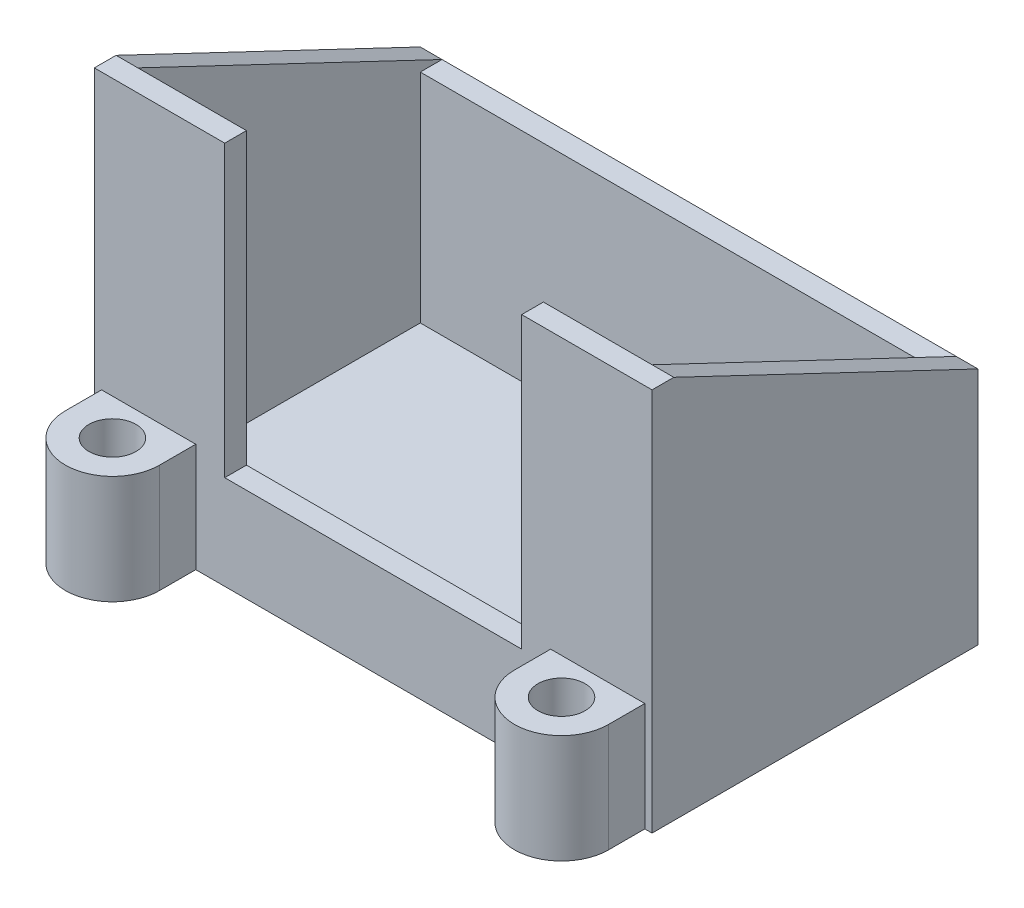
ISO-10303-21;
HEADER;
FILE_DESCRIPTION(('STEP AP214'),'2;1');
FILE_NAME('part.step','',(''),(''),'','','');
FILE_SCHEMA(('AUTOMOTIVE_DESIGN { 1 0 10303 214 1 1 1 1 }'));
ENDSEC;
DATA;
#1=APPLICATION_CONTEXT('core data for automotive mechanical design processes');
#2=APPLICATION_PROTOCOL_DEFINITION('international standard','automotive_design',2000,#1);
#3=PRODUCT_CONTEXT('',#1,'mechanical');
#4=PRODUCT('Part','Part','',(#3));
#5=PRODUCT_RELATED_PRODUCT_CATEGORY('part','',(#4));
#6=PRODUCT_DEFINITION_FORMATION('','',#4);
#7=PRODUCT_DEFINITION_CONTEXT('part definition',#1,'design');
#8=PRODUCT_DEFINITION('design','',#6,#7);
#9=PRODUCT_DEFINITION_SHAPE('','',#8);
#10=(LENGTH_UNIT() NAMED_UNIT(*) SI_UNIT(.MILLI.,.METRE.));
#11=(NAMED_UNIT(*) PLANE_ANGLE_UNIT() SI_UNIT($,.RADIAN.));
#12=(NAMED_UNIT(*) SI_UNIT($,.STERADIAN.) SOLID_ANGLE_UNIT());
#13=UNCERTAINTY_MEASURE_WITH_UNIT(LENGTH_MEASURE(1.E-05),#10,'distance_accuracy_value','');
#14=(GEOMETRIC_REPRESENTATION_CONTEXT(3) GLOBAL_UNCERTAINTY_ASSIGNED_CONTEXT((#13)) GLOBAL_UNIT_ASSIGNED_CONTEXT((#10,
#11,#12)) REPRESENTATION_CONTEXT('',''));
#15=CARTESIAN_POINT('',(0.,0.,0.));
#16=DIRECTION('',(0.,0.,1.));
#17=DIRECTION('',(1.,0.,0.));
#18=AXIS2_PLACEMENT_3D('',#15,#16,#17);
#19=CARTESIAN_POINT('',(38.5,33.,22.5));
#20=DIRECTION('',(0.,0.,-1.));
#21=DIRECTION('',(-1.,0.,0.));
#22=AXIS2_PLACEMENT_3D('',#19,#20,#21);
#23=PLANE('',#22);
#24=DIRECTION('',(0.,-1.,0.));
#25=VECTOR('',#24,1.);
#26=CARTESIAN_POINT('',(37.5,15.,22.5));
#27=LINE('',#26,#25);
#28=CARTESIAN_POINT('',(37.5,15.,22.5));
#29=VERTEX_POINT('',#28);
#30=CARTESIAN_POINT('',(37.5,0.,22.5));
#31=VERTEX_POINT('',#30);
#32=EDGE_CURVE('E195',#29,#31,#27,.T.);
#33=ORIENTED_EDGE('',*,*,#32,.T.);
#34=DIRECTION('',(1.,0.,0.));
#35=VECTOR('',#34,1.);
#36=CARTESIAN_POINT('',(38.5,0.,22.5));
#37=LINE('',#36,#35);
#38=CARTESIAN_POINT('',(38.5,0.,22.5));
#39=VERTEX_POINT('',#38);
#40=EDGE_CURVE('E396',#31,#39,#37,.T.);
#41=ORIENTED_EDGE('',*,*,#40,.T.);
#42=DIRECTION('',(0.,-1.,0.));
#43=VECTOR('',#42,1.);
#44=CARTESIAN_POINT('',(38.5,33.,22.5));
#45=LINE('',#44,#43);
#46=CARTESIAN_POINT('',(38.5,53.,22.5));
#47=VERTEX_POINT('',#46);
#48=EDGE_CURVE('E48',#47,#39,#45,.T.);
#49=ORIENTED_EDGE('',*,*,#48,.F.);
#50=DIRECTION('',(1.,0.,0.));
#51=VECTOR('',#50,1.);
#52=CARTESIAN_POINT('',(20.5,53.,22.5));
#53=LINE('',#52,#51);
#54=CARTESIAN_POINT('',(20.5,53.,22.5));
#55=VERTEX_POINT('',#54);
#56=EDGE_CURVE('E312',#55,#47,#53,.T.);
#57=ORIENTED_EDGE('',*,*,#56,.F.);
#58=DIRECTION('',(0.,1.,0.));
#59=VECTOR('',#58,1.);
#60=CARTESIAN_POINT('',(20.5,3.,22.5));
#61=LINE('',#60,#59);
#62=CARTESIAN_POINT('',(20.5,13.,22.5));
#63=VERTEX_POINT('',#62);
#64=EDGE_CURVE('E377',#63,#55,#61,.T.);
#65=ORIENTED_EDGE('',*,*,#64,.F.);
#66=DIRECTION('',(1.,0.,0.));
#67=VECTOR('',#66,1.);
#68=CARTESIAN_POINT('',(-20.5,13.,22.5));
#69=LINE('',#68,#67);
#70=CARTESIAN_POINT('',(-20.5,13.,22.5));
#71=VERTEX_POINT('',#70);
#72=EDGE_CURVE('E270',#71,#63,#69,.T.);
#73=ORIENTED_EDGE('',*,*,#72,.F.);
#74=DIRECTION('',(0.,1.,0.));
#75=VECTOR('',#74,1.);
#76=CARTESIAN_POINT('',(-20.5,3.,22.5));
#77=LINE('',#76,#75);
#78=CARTESIAN_POINT('',(-20.5,53.,22.5));
#79=VERTEX_POINT('',#78);
#80=EDGE_CURVE('E380',#71,#79,#77,.T.);
#81=ORIENTED_EDGE('',*,*,#80,.T.);
#82=DIRECTION('',(1.,0.,0.));
#83=VECTOR('',#82,1.);
#84=CARTESIAN_POINT('',(-20.5,53.,22.5));
#85=LINE('',#84,#83);
#86=CARTESIAN_POINT('',(-38.5,53.,22.5));
#87=VERTEX_POINT('',#86);
#88=EDGE_CURVE('E337',#87,#79,#85,.T.);
#89=ORIENTED_EDGE('',*,*,#88,.F.);
#90=DIRECTION('',(0.,-1.,0.));
#91=VECTOR('',#90,1.);
#92=CARTESIAN_POINT('',(-38.5,33.,22.5));
#93=LINE('',#92,#91);
#94=CARTESIAN_POINT('',(-38.5,0.,22.5));
#95=VERTEX_POINT('',#94);
#96=EDGE_CURVE('E11',#87,#95,#93,.T.);
#97=ORIENTED_EDGE('',*,*,#96,.T.);
#98=CARTESIAN_POINT('',(-37.5,0.,22.5));
#99=VERTEX_POINT('',#98);
#100=EDGE_CURVE('E397',#95,#99,#37,.T.);
#101=ORIENTED_EDGE('',*,*,#100,.T.);
#102=DIRECTION('',(0.,-1.,0.));
#103=VECTOR('',#102,1.);
#104=CARTESIAN_POINT('',(-37.5,15.,22.5));
#105=LINE('',#104,#103);
#106=CARTESIAN_POINT('',(-37.5,15.,22.5));
#107=VERTEX_POINT('',#106);
#108=EDGE_CURVE('E255',#107,#99,#105,.T.);
#109=ORIENTED_EDGE('',*,*,#108,.F.);
#110=DIRECTION('',(-1.,0.,0.));
#111=VECTOR('',#110,1.);
#112=CARTESIAN_POINT('',(-24.5,15.,22.5));
#113=LINE('',#112,#111);
#114=CARTESIAN_POINT('',(-24.5,15.,22.5));
#115=VERTEX_POINT('',#114);
#116=EDGE_CURVE('E237',#115,#107,#113,.T.);
#117=ORIENTED_EDGE('',*,*,#116,.F.);
#118=DIRECTION('',(0.,-1.,0.));
#119=VECTOR('',#118,1.);
#120=CARTESIAN_POINT('',(-24.5,15.,22.5));
#121=LINE('',#120,#119);
#122=CARTESIAN_POINT('',(-24.5,0.,22.5));
#123=VERTEX_POINT('',#122);
#124=EDGE_CURVE('E258',#115,#123,#121,.T.);
#125=ORIENTED_EDGE('',*,*,#124,.T.);
#126=CARTESIAN_POINT('',(24.5,0.,22.5));
#127=VERTEX_POINT('',#126);
#128=EDGE_CURVE('E402',#123,#127,#37,.T.);
#129=ORIENTED_EDGE('',*,*,#128,.T.);
#130=DIRECTION('',(0.,-1.,0.));
#131=VECTOR('',#130,1.);
#132=CARTESIAN_POINT('',(24.5,15.,22.5));
#133=LINE('',#132,#131);
#134=CARTESIAN_POINT('',(24.5,15.,22.5));
#135=VERTEX_POINT('',#134);
#136=EDGE_CURVE('E60',#135,#127,#133,.T.);
#137=ORIENTED_EDGE('',*,*,#136,.F.);
#138=DIRECTION('',(-1.,0.,0.));
#139=VECTOR('',#138,1.);
#140=CARTESIAN_POINT('',(37.5,15.,22.5));
#141=LINE('',#140,#139);
#142=EDGE_CURVE('E55',#29,#135,#141,.T.);
#143=ORIENTED_EDGE('',*,*,#142,.F.);
#144=EDGE_LOOP('',(#33,#41,#49,#57,#65,#73,#81,#89,#97,#101,#109,#117,#125,#129,#137,#143));
#145=FACE_BOUND('',#144,.T.);
#146=ADVANCED_FACE('F39',(#145),#23,.F.);
#147=CARTESIAN_POINT('',(0.,3.,0.));
#148=DIRECTION('',(0.,1.,0.));
#149=DIRECTION('',(0.,0.,1.));
#150=AXIS2_PLACEMENT_3D('',#147,#148,#149);
#151=PLANE('',#150);
#152=DIRECTION('',(0.,0.,1.));
#153=VECTOR('',#152,1.);
#154=CARTESIAN_POINT('',(-35.5,3.,19.5));
#155=LINE('',#154,#153);
#156=CARTESIAN_POINT('',(-35.5,3.,-19.5));
#157=VERTEX_POINT('',#156);
#158=CARTESIAN_POINT('',(-35.5,3.,19.5));
#159=VERTEX_POINT('',#158);
#160=EDGE_CURVE('E342',#157,#159,#155,.T.);
#161=ORIENTED_EDGE('',*,*,#160,.T.);
#162=DIRECTION('',(1.,0.,0.));
#163=VECTOR('',#162,1.);
#164=CARTESIAN_POINT('',(20.5,3.,19.5));
#165=LINE('',#164,#163);
#166=CARTESIAN_POINT('',(35.5,3.,19.5));
#167=VERTEX_POINT('',#166);
#168=EDGE_CURVE('E346',#159,#167,#165,.T.);
#169=ORIENTED_EDGE('',*,*,#168,.T.);
#170=DIRECTION('',(0.,0.,-1.));
#171=VECTOR('',#170,1.);
#172=CARTESIAN_POINT('',(35.5,3.,19.5));
#173=LINE('',#172,#171);
#174=CARTESIAN_POINT('',(35.5,3.,-19.5));
#175=VERTEX_POINT('',#174);
#176=EDGE_CURVE('E350',#167,#175,#173,.T.);
#177=ORIENTED_EDGE('',*,*,#176,.T.);
#178=DIRECTION('',(-1.,0.,0.));
#179=VECTOR('',#178,1.);
#180=CARTESIAN_POINT('',(35.5,3.,-19.5));
#181=LINE('',#180,#179);
#182=EDGE_CURVE('E354',#175,#157,#181,.T.);
#183=ORIENTED_EDGE('',*,*,#182,.T.);
#184=EDGE_LOOP('',(#161,#169,#177,#183));
#185=FACE_BOUND('',#184,.T.);
#186=ADVANCED_FACE('F472',(#185),#151,.T.);
#187=CARTESIAN_POINT('',(0.,33.,0.));
#188=DIRECTION('',(0.,1.,0.));
#189=DIRECTION('',(0.,0.,1.));
#190=AXIS2_PLACEMENT_3D('',#187,#188,#189);
#191=PLANE('',#190);
#192=DIRECTION('',(-1.,0.,0.));
#193=VECTOR('',#192,1.);
#194=CARTESIAN_POINT('',(38.5,33.,-22.5));
#195=LINE('',#194,#193);
#196=CARTESIAN_POINT('',(35.5,33.,-22.5));
#197=VERTEX_POINT('',#196);
#198=CARTESIAN_POINT('',(-35.5,33.,-22.5));
#199=VERTEX_POINT('',#198);
#200=EDGE_CURVE('E392',#197,#199,#195,.T.);
#201=ORIENTED_EDGE('',*,*,#200,.T.);
#202=DIRECTION('',(0.,0.,-1.));
#203=VECTOR('',#202,1.);
#204=CARTESIAN_POINT('',(-35.5,33.,-22.5));
#205=LINE('',#204,#203);
#206=CARTESIAN_POINT('',(-35.5,33.,-19.5));
#207=VERTEX_POINT('',#206);
#208=EDGE_CURVE('E284',#207,#199,#205,.T.);
#209=ORIENTED_EDGE('',*,*,#208,.F.);
#210=DIRECTION('',(-1.,0.,0.));
#211=VECTOR('',#210,1.);
#212=CARTESIAN_POINT('',(35.5,33.,-19.5));
#213=LINE('',#212,#211);
#214=CARTESIAN_POINT('',(35.5,33.,-19.5));
#215=VERTEX_POINT('',#214);
#216=EDGE_CURVE('E341',#215,#207,#213,.T.);
#217=ORIENTED_EDGE('',*,*,#216,.F.);
#218=DIRECTION('',(0.,0.,-1.));
#219=VECTOR('',#218,1.);
#220=CARTESIAN_POINT('',(35.5,33.,-22.5));
#221=LINE('',#220,#219);
#222=EDGE_CURVE('E301',#215,#197,#221,.T.);
#223=ORIENTED_EDGE('',*,*,#222,.T.);
#224=EDGE_LOOP('',(#201,#209,#217,#223));
#225=FACE_BOUND('',#224,.T.);
#226=ADVANCED_FACE('F456',(#225),#191,.T.);
#227=CARTESIAN_POINT('',(20.5,3.,19.5));
#228=DIRECTION('',(0.,0.,1.));
#229=DIRECTION('',(1.,0.,0.));
#230=AXIS2_PLACEMENT_3D('',#227,#228,#229);
#231=PLANE('',#230);
#232=DIRECTION('',(-1.,0.,0.));
#233=VECTOR('',#232,1.);
#234=CARTESIAN_POINT('',(20.5,53.,19.5));
#235=LINE('',#234,#233);
#236=CARTESIAN_POINT('',(35.5,53.,19.5));
#237=VERTEX_POINT('',#236);
#238=CARTESIAN_POINT('',(20.5,53.,19.5));
#239=VERTEX_POINT('',#238);
#240=EDGE_CURVE('E320',#237,#239,#235,.T.);
#241=ORIENTED_EDGE('',*,*,#240,.F.);
#242=DIRECTION('',(0.,1.,0.));
#243=VECTOR('',#242,1.);
#244=CARTESIAN_POINT('',(35.5,3.,19.5));
#245=LINE('',#244,#243);
#246=EDGE_CURVE('E371',#167,#237,#245,.T.);
#247=ORIENTED_EDGE('',*,*,#246,.F.);
#248=ORIENTED_EDGE('',*,*,#168,.F.);
#249=DIRECTION('',(0.,1.,0.));
#250=VECTOR('',#249,1.);
#251=CARTESIAN_POINT('',(-35.5,3.,19.5));
#252=LINE('',#251,#250);
#253=CARTESIAN_POINT('',(-35.5,53.,19.5));
#254=VERTEX_POINT('',#253);
#255=EDGE_CURVE('E358',#159,#254,#252,.T.);
#256=ORIENTED_EDGE('',*,*,#255,.T.);
#257=DIRECTION('',(-1.,0.,0.));
#258=VECTOR('',#257,1.);
#259=CARTESIAN_POINT('',(-20.5,53.,19.5));
#260=LINE('',#259,#258);
#261=CARTESIAN_POINT('',(-20.5,53.,19.5));
#262=VERTEX_POINT('',#261);
#263=EDGE_CURVE('E329',#262,#254,#260,.T.);
#264=ORIENTED_EDGE('',*,*,#263,.F.);
#265=DIRECTION('',(0.,1.,0.));
#266=VECTOR('',#265,1.);
#267=CARTESIAN_POINT('',(-20.5,3.,19.5));
#268=LINE('',#267,#266);
#269=CARTESIAN_POINT('',(-20.5,13.,19.5));
#270=VERTEX_POINT('',#269);
#271=EDGE_CURVE('E383',#270,#262,#268,.T.);
#272=ORIENTED_EDGE('',*,*,#271,.F.);
#273=DIRECTION('',(-1.,0.,0.));
#274=VECTOR('',#273,1.);
#275=CARTESIAN_POINT('',(-20.5,13.,19.5));
#276=LINE('',#275,#274);
#277=CARTESIAN_POINT('',(20.5,13.,19.5));
#278=VERTEX_POINT('',#277);
#279=EDGE_CURVE('E276',#278,#270,#276,.T.);
#280=ORIENTED_EDGE('',*,*,#279,.F.);
#281=DIRECTION('',(0.,1.,0.));
#282=VECTOR('',#281,1.);
#283=CARTESIAN_POINT('',(20.5,3.,19.5));
#284=LINE('',#283,#282);
#285=EDGE_CURVE('E374',#278,#239,#284,.T.);
#286=ORIENTED_EDGE('',*,*,#285,.T.);
#287=EDGE_LOOP('',(#241,#247,#248,#256,#264,#272,#280,#286));
#288=FACE_BOUND('',#287,.T.);
#289=ADVANCED_FACE('F447',(#288),#231,.F.);
#290=CARTESIAN_POINT('',(-38.5,33.,22.5));
#291=DIRECTION('',(1.,0.,0.));
#292=DIRECTION('',(0.,0.,-1.));
#293=AXIS2_PLACEMENT_3D('',#290,#291,#292);
#294=PLANE('',#293);
#295=DIRECTION('',(0.,0.,1.));
#296=VECTOR('',#295,1.);
#297=CARTESIAN_POINT('',(-38.5,0.,22.5));
#298=LINE('',#297,#296);
#299=CARTESIAN_POINT('',(-38.5,0.,-22.5));
#300=VERTEX_POINT('',#299);
#301=EDGE_CURVE('E366',#300,#95,#298,.T.);
#302=ORIENTED_EDGE('',*,*,#301,.T.);
#303=ORIENTED_EDGE('',*,*,#96,.F.);
#304=DIRECTION('',(0.,0.,1.));
#305=VECTOR('',#304,1.);
#306=CARTESIAN_POINT('',(-38.5,53.,19.5));
#307=LINE('',#306,#305);
#308=CARTESIAN_POINT('',(-38.5,53.,19.5));
#309=VERTEX_POINT('',#308);
#310=EDGE_CURVE('E333',#309,#87,#307,.T.);
#311=ORIENTED_EDGE('',*,*,#310,.F.);
#312=DIRECTION('',(0.,0.429933580392348,0.90286051882393));
#313=VECTOR('',#312,1.);
#314=CARTESIAN_POINT('',(-38.5,53.,19.5));
#315=LINE('',#314,#313);
#316=CARTESIAN_POINT('',(-38.5,33.,-22.5));
#317=VERTEX_POINT('',#316);
#318=EDGE_CURVE('E279',#317,#309,#315,.T.);
#319=ORIENTED_EDGE('',*,*,#318,.F.);
#320=DIRECTION('',(0.,-1.,0.));
#321=VECTOR('',#320,1.);
#322=CARTESIAN_POINT('',(-38.5,33.,-22.5));
#323=LINE('',#322,#321);
#324=EDGE_CURVE('E391',#317,#300,#323,.T.);
#325=ORIENTED_EDGE('',*,*,#324,.T.);
#326=EDGE_LOOP('',(#302,#303,#311,#319,#325));
#327=FACE_BOUND('',#326,.T.);
#328=ADVANCED_FACE('F41',(#327),#294,.F.);
#329=CARTESIAN_POINT('',(38.5,33.,22.5));
#330=DIRECTION('',(-1.,0.,0.));
#331=DIRECTION('',(0.,0.,1.));
#332=AXIS2_PLACEMENT_3D('',#329,#330,#331);
#333=PLANE('',#332);
#334=DIRECTION('',(0.,-1.,0.));
#335=VECTOR('',#334,1.);
#336=CARTESIAN_POINT('',(38.5,33.,-22.5));
#337=LINE('',#336,#335);
#338=CARTESIAN_POINT('',(38.5,33.,-22.5));
#339=VERTEX_POINT('',#338);
#340=CARTESIAN_POINT('',(38.5,0.,-22.5));
#341=VERTEX_POINT('',#340);
#342=EDGE_CURVE('E411',#339,#341,#337,.T.);
#343=ORIENTED_EDGE('',*,*,#342,.F.);
#344=DIRECTION('',(0.,0.429933580392348,0.90286051882393));
#345=VECTOR('',#344,1.);
#346=CARTESIAN_POINT('',(38.5,53.,19.5));
#347=LINE('',#346,#345);
#348=CARTESIAN_POINT('',(38.5,53.,19.5));
#349=VERTEX_POINT('',#348);
#350=EDGE_CURVE('E294',#339,#349,#347,.T.);
#351=ORIENTED_EDGE('',*,*,#350,.T.);
#352=DIRECTION('',(0.,0.,-1.));
#353=VECTOR('',#352,1.);
#354=CARTESIAN_POINT('',(38.5,53.,19.5));
#355=LINE('',#354,#353);
#356=EDGE_CURVE('E316',#47,#349,#355,.T.);
#357=ORIENTED_EDGE('',*,*,#356,.F.);
#358=ORIENTED_EDGE('',*,*,#48,.T.);
#359=DIRECTION('',(0.,0.,-1.));
#360=VECTOR('',#359,1.);
#361=CARTESIAN_POINT('',(38.5,0.,22.5));
#362=LINE('',#361,#360);
#363=EDGE_CURVE('E401',#39,#341,#362,.T.);
#364=ORIENTED_EDGE('',*,*,#363,.T.);
#365=EDGE_LOOP('',(#343,#351,#357,#358,#364));
#366=FACE_BOUND('',#365,.T.);
#367=ADVANCED_FACE('F420',(#366),#333,.F.);
#368=CARTESIAN_POINT('',(38.5,33.,-22.5));
#369=DIRECTION('',(0.,0.,1.));
#370=DIRECTION('',(1.,0.,0.));
#371=AXIS2_PLACEMENT_3D('',#368,#369,#370);
#372=PLANE('',#371);
#373=DIRECTION('',(-1.,0.,0.));
#374=VECTOR('',#373,1.);
#375=CARTESIAN_POINT('',(38.5,0.,-22.5));
#376=LINE('',#375,#374);
#377=EDGE_CURVE('E405',#341,#300,#376,.T.);
#378=ORIENTED_EDGE('',*,*,#377,.T.);
#379=ORIENTED_EDGE('',*,*,#324,.F.);
#380=DIRECTION('',(-1.,0.,0.));
#381=VECTOR('',#380,1.);
#382=CARTESIAN_POINT('',(-35.5,33.,-22.5));
#383=LINE('',#382,#381);
#384=EDGE_CURVE('E287',#199,#317,#383,.T.);
#385=ORIENTED_EDGE('',*,*,#384,.F.);
#386=ORIENTED_EDGE('',*,*,#200,.F.);
#387=EDGE_CURVE('E388',#339,#197,#195,.T.);
#388=ORIENTED_EDGE('',*,*,#387,.F.);
#389=ORIENTED_EDGE('',*,*,#342,.T.);
#390=EDGE_LOOP('',(#378,#379,#385,#386,#388,#389));
#391=FACE_BOUND('',#390,.T.);
#392=ADVANCED_FACE('F429',(#391),#372,.F.);
#393=CARTESIAN_POINT('',(0.,0.,0.));
#394=DIRECTION('',(0.,1.,0.));
#395=DIRECTION('',(0.,0.,1.));
#396=AXIS2_PLACEMENT_3D('',#393,#394,#395);
#397=PLANE('',#396);
#398=ORIENTED_EDGE('',*,*,#301,.F.);
#399=ORIENTED_EDGE('',*,*,#377,.F.);
#400=ORIENTED_EDGE('',*,*,#363,.F.);
#401=ORIENTED_EDGE('',*,*,#40,.F.);
#402=DIRECTION('',(0.,0.,-1.));
#403=VECTOR('',#402,1.);
#404=CARTESIAN_POINT('',(37.5,0.,27.5));
#405=LINE('',#404,#403);
#406=CARTESIAN_POINT('',(37.5,0.,27.5));
#407=VERTEX_POINT('',#406);
#408=EDGE_CURVE('E574',#407,#31,#405,.T.);
#409=ORIENTED_EDGE('',*,*,#408,.F.);
#410=CARTESIAN_POINT('',(31.,0.,27.5));
#411=DIRECTION('',(0.,1.,0.));
#412=DIRECTION('',(0.,0.,1.));
#413=AXIS2_PLACEMENT_3D('',#410,#411,#412);
#414=CIRCLE('',#413,6.5);
#415=CARTESIAN_POINT('',(24.5,0.,27.5));
#416=VERTEX_POINT('',#415);
#417=EDGE_CURVE('E213',#416,#407,#414,.T.);
#418=ORIENTED_EDGE('',*,*,#417,.F.);
#419=DIRECTION('',(0.,0.,1.));
#420=VECTOR('',#419,1.);
#421=CARTESIAN_POINT('',(24.5,0.,22.5));
#422=LINE('',#421,#420);
#423=EDGE_CURVE('E209',#127,#416,#422,.T.);
#424=ORIENTED_EDGE('',*,*,#423,.F.);
#425=ORIENTED_EDGE('',*,*,#128,.F.);
#426=DIRECTION('',(0.,0.,-1.));
#427=VECTOR('',#426,1.);
#428=CARTESIAN_POINT('',(-24.5,0.,27.5));
#429=LINE('',#428,#427);
#430=CARTESIAN_POINT('',(-24.5,0.,27.5));
#431=VERTEX_POINT('',#430);
#432=EDGE_CURVE('E247',#431,#123,#429,.T.);
#433=ORIENTED_EDGE('',*,*,#432,.F.);
#434=CARTESIAN_POINT('',(-31.,0.,27.5));
#435=DIRECTION('',(0.,1.,0.));
#436=DIRECTION('',(0.,0.,-1.));
#437=AXIS2_PLACEMENT_3D('',#434,#435,#436);
#438=CIRCLE('',#437,6.5);
#439=CARTESIAN_POINT('',(-37.5,0.,27.5));
#440=VERTEX_POINT('',#439);
#441=EDGE_CURVE('E227',#440,#431,#438,.T.);
#442=ORIENTED_EDGE('',*,*,#441,.F.);
#443=DIRECTION('',(0.,0.,1.));
#444=VECTOR('',#443,1.);
#445=CARTESIAN_POINT('',(-37.5,0.,27.5));
#446=LINE('',#445,#444);
#447=EDGE_CURVE('E234',#99,#440,#446,.T.);
#448=ORIENTED_EDGE('',*,*,#447,.F.);
#449=ORIENTED_EDGE('',*,*,#100,.F.);
#450=EDGE_LOOP('',(#398,#399,#400,#401,#409,#418,#424,#425,#433,#442,#448,#449));
#451=FACE_BOUND('',#450,.T.);
#452=CARTESIAN_POINT('',(-31.,0.,27.5));
#453=DIRECTION('',(0.,1.,0.));
#454=DIRECTION('',(0.,0.,1.));
#455=AXIS2_PLACEMENT_3D('',#452,#453,#454);
#456=CIRCLE('',#455,3.25);
#457=CARTESIAN_POINT('',(-31.,0.,30.75));
#458=VERTEX_POINT('',#457);
#459=EDGE_CURVE('E215',#458,#458,#456,.T.);
#460=ORIENTED_EDGE('',*,*,#459,.T.);
#461=EDGE_LOOP('',(#460));
#462=FACE_BOUND('',#461,.T.);
#463=CARTESIAN_POINT('',(31.,0.,27.5));
#464=DIRECTION('',(0.,1.,0.));
#465=DIRECTION('',(0.,0.,1.));
#466=AXIS2_PLACEMENT_3D('',#463,#464,#465);
#467=CIRCLE('',#466,3.24999999999999);
#468=CARTESIAN_POINT('',(31.,0.,30.75));
#469=VERTEX_POINT('',#468);
#470=EDGE_CURVE('E560',#469,#469,#467,.T.);
#471=ORIENTED_EDGE('',*,*,#470,.T.);
#472=EDGE_LOOP('',(#471));
#473=FACE_BOUND('',#472,.T.);
#474=ADVANCED_FACE('F425',(#451,#462,#473),#397,.F.);
#475=CARTESIAN_POINT('',(-35.5,3.,19.5));
#476=DIRECTION('',(-1.,0.,0.));
#477=DIRECTION('',(0.,0.,1.));
#478=AXIS2_PLACEMENT_3D('',#475,#476,#477);
#479=PLANE('',#478);
#480=DIRECTION('',(0.,1.,0.));
#481=VECTOR('',#480,1.);
#482=CARTESIAN_POINT('',(-35.5,3.,-19.5));
#483=LINE('',#482,#481);
#484=EDGE_CURVE('E362',#157,#207,#483,.T.);
#485=ORIENTED_EDGE('',*,*,#484,.T.);
#486=ORIENTED_EDGE('',*,*,#208,.T.);
#487=DIRECTION('',(0.,0.429933580392348,0.90286051882393));
#488=VECTOR('',#487,1.);
#489=CARTESIAN_POINT('',(-35.5,53.,19.5));
#490=LINE('',#489,#488);
#491=EDGE_CURVE('E280',#199,#254,#490,.T.);
#492=ORIENTED_EDGE('',*,*,#491,.T.);
#493=ORIENTED_EDGE('',*,*,#255,.F.);
#494=ORIENTED_EDGE('',*,*,#160,.F.);
#495=EDGE_LOOP('',(#485,#486,#492,#493,#494));
#496=FACE_BOUND('',#495,.T.);
#497=ADVANCED_FACE('F452',(#496),#479,.F.);
#498=CARTESIAN_POINT('',(35.5,3.,-19.5));
#499=DIRECTION('',(0.,0.,-1.));
#500=DIRECTION('',(-1.,0.,0.));
#501=AXIS2_PLACEMENT_3D('',#498,#499,#500);
#502=PLANE('',#501);
#503=ORIENTED_EDGE('',*,*,#216,.T.);
#504=ORIENTED_EDGE('',*,*,#484,.F.);
#505=ORIENTED_EDGE('',*,*,#182,.F.);
#506=DIRECTION('',(0.,1.,0.));
#507=VECTOR('',#506,1.);
#508=CARTESIAN_POINT('',(35.5,3.,-19.5));
#509=LINE('',#508,#507);
#510=EDGE_CURVE('E367',#175,#215,#509,.T.);
#511=ORIENTED_EDGE('',*,*,#510,.T.);
#512=EDGE_LOOP('',(#503,#504,#505,#511));
#513=FACE_BOUND('',#512,.T.);
#514=ADVANCED_FACE('F489',(#513),#502,.F.);
#515=CARTESIAN_POINT('',(35.5,3.,19.5));
#516=DIRECTION('',(1.,0.,0.));
#517=DIRECTION('',(0.,0.,-1.));
#518=AXIS2_PLACEMENT_3D('',#515,#516,#517);
#519=PLANE('',#518);
#520=ORIENTED_EDGE('',*,*,#246,.T.);
#521=DIRECTION('',(0.,0.429933580392348,0.90286051882393));
#522=VECTOR('',#521,1.);
#523=CARTESIAN_POINT('',(35.5,53.,19.5));
#524=LINE('',#523,#522);
#525=EDGE_CURVE('E297',#197,#237,#524,.T.);
#526=ORIENTED_EDGE('',*,*,#525,.F.);
#527=ORIENTED_EDGE('',*,*,#222,.F.);
#528=ORIENTED_EDGE('',*,*,#510,.F.);
#529=ORIENTED_EDGE('',*,*,#176,.F.);
#530=EDGE_LOOP('',(#520,#526,#527,#528,#529));
#531=FACE_BOUND('',#530,.T.);
#532=ADVANCED_FACE('F496',(#531),#519,.F.);
#533=CARTESIAN_POINT('',(20.5,3.,19.5));
#534=DIRECTION('',(1.,0.,0.));
#535=DIRECTION('',(0.,0.,-1.));
#536=AXIS2_PLACEMENT_3D('',#533,#534,#535);
#537=PLANE('',#536);
#538=ORIENTED_EDGE('',*,*,#285,.F.);
#539=DIRECTION('',(0.,0.,-1.));
#540=VECTOR('',#539,1.);
#541=CARTESIAN_POINT('',(20.5,13.,19.5));
#542=LINE('',#541,#540);
#543=EDGE_CURVE('E273',#63,#278,#542,.T.);
#544=ORIENTED_EDGE('',*,*,#543,.F.);
#545=ORIENTED_EDGE('',*,*,#64,.T.);
#546=DIRECTION('',(0.,0.,1.));
#547=VECTOR('',#546,1.);
#548=CARTESIAN_POINT('',(20.5,53.,19.5));
#549=LINE('',#548,#547);
#550=EDGE_CURVE('E305',#239,#55,#549,.T.);
#551=ORIENTED_EDGE('',*,*,#550,.F.);
#552=EDGE_LOOP('',(#538,#544,#545,#551));
#553=FACE_BOUND('',#552,.T.);
#554=ADVANCED_FACE('F468',(#553),#537,.F.);
#555=CARTESIAN_POINT('',(-20.5,3.,19.5));
#556=DIRECTION('',(-1.,0.,0.));
#557=DIRECTION('',(0.,0.,1.));
#558=AXIS2_PLACEMENT_3D('',#555,#556,#557);
#559=PLANE('',#558);
#560=ORIENTED_EDGE('',*,*,#80,.F.);
#561=DIRECTION('',(0.,0.,1.));
#562=VECTOR('',#561,1.);
#563=CARTESIAN_POINT('',(-20.5,13.,19.5));
#564=LINE('',#563,#562);
#565=EDGE_CURVE('E266',#270,#71,#564,.T.);
#566=ORIENTED_EDGE('',*,*,#565,.F.);
#567=ORIENTED_EDGE('',*,*,#271,.T.);
#568=DIRECTION('',(0.,0.,-1.));
#569=VECTOR('',#568,1.);
#570=CARTESIAN_POINT('',(-20.5,53.,19.5));
#571=LINE('',#570,#569);
#572=EDGE_CURVE('E325',#79,#262,#571,.T.);
#573=ORIENTED_EDGE('',*,*,#572,.F.);
#574=EDGE_LOOP('',(#560,#566,#567,#573));
#575=FACE_BOUND('',#574,.T.);
#576=ADVANCED_FACE('F490',(#575),#559,.F.);
#577=CARTESIAN_POINT('',(0.,53.,0.));
#578=DIRECTION('',(0.,-1.,0.));
#579=DIRECTION('',(0.,0.,-1.));
#580=AXIS2_PLACEMENT_3D('',#577,#578,#579);
#581=PLANE('',#580);
#582=ORIENTED_EDGE('',*,*,#572,.T.);
#583=ORIENTED_EDGE('',*,*,#263,.T.);
#584=DIRECTION('',(-1.,0.,0.));
#585=VECTOR('',#584,1.);
#586=CARTESIAN_POINT('',(-35.5,53.,19.5));
#587=LINE('',#586,#585);
#588=EDGE_CURVE('E290',#254,#309,#587,.T.);
#589=ORIENTED_EDGE('',*,*,#588,.T.);
#590=ORIENTED_EDGE('',*,*,#310,.T.);
#591=ORIENTED_EDGE('',*,*,#88,.T.);
#592=EDGE_LOOP('',(#582,#583,#589,#590,#591));
#593=FACE_BOUND('',#592,.T.);
#594=ADVANCED_FACE('F440',(#593),#581,.F.);
#595=CARTESIAN_POINT('',(0.,53.,0.));
#596=DIRECTION('',(0.,1.,0.));
#597=DIRECTION('',(0.,0.,1.));
#598=AXIS2_PLACEMENT_3D('',#595,#596,#597);
#599=PLANE('',#598);
#600=ORIENTED_EDGE('',*,*,#550,.T.);
#601=ORIENTED_EDGE('',*,*,#56,.T.);
#602=ORIENTED_EDGE('',*,*,#356,.T.);
#603=EDGE_CURVE('E321',#349,#237,#235,.T.);
#604=ORIENTED_EDGE('',*,*,#603,.T.);
#605=ORIENTED_EDGE('',*,*,#240,.T.);
#606=EDGE_LOOP('',(#600,#601,#602,#604,#605));
#607=FACE_BOUND('',#606,.T.);
#608=ADVANCED_FACE('F465',(#607),#599,.T.);
#609=CARTESIAN_POINT('',(35.5,53.,19.5));
#610=DIRECTION('',(0.,0.90286051882393,-0.429933580392348));
#611=DIRECTION('',(0.,0.429933580392348,0.90286051882393));
#612=AXIS2_PLACEMENT_3D('',#609,#610,#611);
#613=PLANE('',#612);
#614=ORIENTED_EDGE('',*,*,#350,.F.);
#615=ORIENTED_EDGE('',*,*,#387,.T.);
#616=ORIENTED_EDGE('',*,*,#525,.T.);
#617=ORIENTED_EDGE('',*,*,#603,.F.);
#618=EDGE_LOOP('',(#614,#615,#616,#617));
#619=FACE_BOUND('',#618,.T.);
#620=ADVANCED_FACE('F509',(#619),#613,.T.);
#621=CARTESIAN_POINT('',(-35.5,53.,19.5));
#622=DIRECTION('',(0.,-0.90286051882393,0.429933580392348));
#623=DIRECTION('',(0.,-0.429933580392348,-0.90286051882393));
#624=AXIS2_PLACEMENT_3D('',#621,#622,#623);
#625=PLANE('',#624);
#626=ORIENTED_EDGE('',*,*,#318,.T.);
#627=ORIENTED_EDGE('',*,*,#588,.F.);
#628=ORIENTED_EDGE('',*,*,#491,.F.);
#629=ORIENTED_EDGE('',*,*,#384,.T.);
#630=EDGE_LOOP('',(#626,#627,#628,#629));
#631=FACE_BOUND('',#630,.T.);
#632=ADVANCED_FACE('F437',(#631),#625,.F.);
#633=CARTESIAN_POINT('',(0.,13.,0.));
#634=DIRECTION('',(0.,1.,0.));
#635=DIRECTION('',(0.,0.,1.));
#636=AXIS2_PLACEMENT_3D('',#633,#634,#635);
#637=PLANE('',#636);
#638=ORIENTED_EDGE('',*,*,#565,.T.);
#639=ORIENTED_EDGE('',*,*,#72,.T.);
#640=ORIENTED_EDGE('',*,*,#543,.T.);
#641=ORIENTED_EDGE('',*,*,#279,.T.);
#642=EDGE_LOOP('',(#638,#639,#640,#641));
#643=FACE_BOUND('',#642,.T.);
#644=ADVANCED_FACE('F515',(#643),#637,.T.);
#645=CARTESIAN_POINT('',(-31.,15.,27.5));
#646=DIRECTION('',(0.,-1.,0.));
#647=DIRECTION('',(0.,0.,-1.));
#648=AXIS2_PLACEMENT_3D('',#645,#646,#647);
#649=PLANE('',#648);
#650=CARTESIAN_POINT('',(-31.,15.,27.5));
#651=DIRECTION('',(0.,1.,0.));
#652=DIRECTION('',(0.,0.,-1.));
#653=AXIS2_PLACEMENT_3D('',#650,#651,#652);
#654=CIRCLE('',#653,6.5);
#655=CARTESIAN_POINT('',(-37.5,15.,27.5));
#656=VERTEX_POINT('',#655);
#657=CARTESIAN_POINT('',(-24.5,15.,27.5));
#658=VERTEX_POINT('',#657);
#659=EDGE_CURVE('E229',#656,#658,#654,.T.);
#660=ORIENTED_EDGE('',*,*,#659,.T.);
#661=DIRECTION('',(0.,0.,-1.));
#662=VECTOR('',#661,1.);
#663=CARTESIAN_POINT('',(-24.5,15.,27.5));
#664=LINE('',#663,#662);
#665=EDGE_CURVE('E233',#658,#115,#664,.T.);
#666=ORIENTED_EDGE('',*,*,#665,.T.);
#667=ORIENTED_EDGE('',*,*,#116,.T.);
#668=DIRECTION('',(0.,0.,1.));
#669=VECTOR('',#668,1.);
#670=CARTESIAN_POINT('',(-37.5,15.,27.5));
#671=LINE('',#670,#669);
#672=EDGE_CURVE('E240',#107,#656,#671,.T.);
#673=ORIENTED_EDGE('',*,*,#672,.T.);
#674=EDGE_LOOP('',(#660,#666,#667,#673));
#675=FACE_BOUND('',#674,.T.);
#676=CARTESIAN_POINT('',(-31.,15.,27.5));
#677=DIRECTION('',(0.,1.,0.));
#678=DIRECTION('',(0.,0.,1.));
#679=AXIS2_PLACEMENT_3D('',#676,#677,#678);
#680=CIRCLE('',#679,3.25);
#681=CARTESIAN_POINT('',(-31.,15.,30.75));
#682=VERTEX_POINT('',#681);
#683=EDGE_CURVE('E220',#682,#682,#680,.T.);
#684=ORIENTED_EDGE('',*,*,#683,.F.);
#685=EDGE_LOOP('',(#684));
#686=FACE_BOUND('',#685,.T.);
#687=ADVANCED_FACE('F518',(#675,#686),#649,.F.);
#688=CARTESIAN_POINT('',(-31.,15.,27.5));
#689=DIRECTION('',(0.,-1.,0.));
#690=DIRECTION('',(0.,0.,-1.));
#691=AXIS2_PLACEMENT_3D('',#688,#689,#690);
#692=CYLINDRICAL_SURFACE('',#691,6.5);
#693=ORIENTED_EDGE('',*,*,#441,.T.);
#694=DIRECTION('',(0.,-1.,0.));
#695=VECTOR('',#694,1.);
#696=CARTESIAN_POINT('',(-24.5,15.,27.5));
#697=LINE('',#696,#695);
#698=EDGE_CURVE('E262',#658,#431,#697,.T.);
#699=ORIENTED_EDGE('',*,*,#698,.F.);
#700=ORIENTED_EDGE('',*,*,#659,.F.);
#701=DIRECTION('',(0.,-1.,0.));
#702=VECTOR('',#701,1.);
#703=CARTESIAN_POINT('',(-37.5,15.,27.5));
#704=LINE('',#703,#702);
#705=EDGE_CURVE('E243',#656,#440,#704,.T.);
#706=ORIENTED_EDGE('',*,*,#705,.T.);
#707=EDGE_LOOP('',(#693,#699,#700,#706));
#708=FACE_BOUND('',#707,.T.);
#709=ADVANCED_FACE('F520',(#708),#692,.T.);
#710=CARTESIAN_POINT('',(-24.5,15.,27.5));
#711=DIRECTION('',(-1.,0.,0.));
#712=DIRECTION('',(0.,0.,1.));
#713=AXIS2_PLACEMENT_3D('',#710,#711,#712);
#714=PLANE('',#713);
#715=ORIENTED_EDGE('',*,*,#432,.T.);
#716=ORIENTED_EDGE('',*,*,#124,.F.);
#717=ORIENTED_EDGE('',*,*,#665,.F.);
#718=ORIENTED_EDGE('',*,*,#698,.T.);
#719=EDGE_LOOP('',(#715,#716,#717,#718));
#720=FACE_BOUND('',#719,.T.);
#721=ADVANCED_FACE('F523',(#720),#714,.F.);
#722=CARTESIAN_POINT('',(-37.5,15.,27.5));
#723=DIRECTION('',(1.,0.,0.));
#724=DIRECTION('',(0.,0.,-1.));
#725=AXIS2_PLACEMENT_3D('',#722,#723,#724);
#726=PLANE('',#725);
#727=ORIENTED_EDGE('',*,*,#447,.T.);
#728=ORIENTED_EDGE('',*,*,#705,.F.);
#729=ORIENTED_EDGE('',*,*,#672,.F.);
#730=ORIENTED_EDGE('',*,*,#108,.T.);
#731=EDGE_LOOP('',(#727,#728,#729,#730));
#732=FACE_BOUND('',#731,.T.);
#733=ADVANCED_FACE('F527',(#732),#726,.F.);
#734=CARTESIAN_POINT('',(-31.,15.,27.5));
#735=DIRECTION('',(0.,-1.,0.));
#736=DIRECTION('',(0.,0.,-1.));
#737=AXIS2_PLACEMENT_3D('',#734,#735,#736);
#738=CYLINDRICAL_SURFACE('',#737,3.25);
#739=ORIENTED_EDGE('',*,*,#683,.T.);
#740=EDGE_LOOP('',(#739));
#741=FACE_BOUND('',#740,.T.);
#742=ORIENTED_EDGE('',*,*,#459,.F.);
#743=EDGE_LOOP('',(#742));
#744=FACE_BOUND('',#743,.T.);
#745=ADVANCED_FACE('F531',(#741,#744),#738,.F.);
#746=CARTESIAN_POINT('',(31.,15.,27.5));
#747=DIRECTION('',(0.,1.,0.));
#748=DIRECTION('',(0.,0.,1.));
#749=AXIS2_PLACEMENT_3D('',#746,#747,#748);
#750=PLANE('',#749);
#751=CARTESIAN_POINT('',(31.,15.,27.5));
#752=DIRECTION('',(0.,1.,0.));
#753=DIRECTION('',(0.,0.,1.));
#754=AXIS2_PLACEMENT_3D('',#751,#752,#753);
#755=CIRCLE('',#754,6.5);
#756=CARTESIAN_POINT('',(24.5,15.,27.5));
#757=VERTEX_POINT('',#756);
#758=CARTESIAN_POINT('',(37.5,15.,27.5));
#759=VERTEX_POINT('',#758);
#760=EDGE_CURVE('E198',#757,#759,#755,.T.);
#761=ORIENTED_EDGE('',*,*,#760,.T.);
#762=DIRECTION('',(0.,0.,-1.));
#763=VECTOR('',#762,1.);
#764=CARTESIAN_POINT('',(37.5,15.,27.5));
#765=LINE('',#764,#763);
#766=EDGE_CURVE('E188',#759,#29,#765,.T.);
#767=ORIENTED_EDGE('',*,*,#766,.T.);
#768=ORIENTED_EDGE('',*,*,#142,.T.);
#769=DIRECTION('',(0.,0.,1.));
#770=VECTOR('',#769,1.);
#771=CARTESIAN_POINT('',(24.5,15.,22.5));
#772=LINE('',#771,#770);
#773=EDGE_CURVE('E204',#135,#757,#772,.T.);
#774=ORIENTED_EDGE('',*,*,#773,.T.);
#775=EDGE_LOOP('',(#761,#767,#768,#774));
#776=FACE_BOUND('',#775,.T.);
#777=CARTESIAN_POINT('',(31.,15.,27.5));
#778=DIRECTION('',(0.,1.,0.));
#779=DIRECTION('',(0.,0.,1.));
#780=AXIS2_PLACEMENT_3D('',#777,#778,#779);
#781=CIRCLE('',#780,3.24999999999999);
#782=CARTESIAN_POINT('',(31.,15.,30.75));
#783=VERTEX_POINT('',#782);
#784=EDGE_CURVE('E557',#783,#783,#781,.T.);
#785=ORIENTED_EDGE('',*,*,#784,.F.);
#786=EDGE_LOOP('',(#785));
#787=FACE_BOUND('',#786,.T.);
#788=ADVANCED_FACE('F201',(#776,#787),#750,.T.);
#789=CARTESIAN_POINT('',(31.,15.,27.5));
#790=DIRECTION('',(0.,-1.,0.));
#791=DIRECTION('',(0.,0.,-1.));
#792=AXIS2_PLACEMENT_3D('',#789,#790,#791);
#793=CYLINDRICAL_SURFACE('',#792,6.5);
#794=ORIENTED_EDGE('',*,*,#417,.T.);
#795=DIRECTION('',(0.,-1.,0.));
#796=VECTOR('',#795,1.);
#797=CARTESIAN_POINT('',(37.5,15.,27.5));
#798=LINE('',#797,#796);
#799=EDGE_CURVE('E193',#759,#407,#798,.T.);
#800=ORIENTED_EDGE('',*,*,#799,.F.);
#801=ORIENTED_EDGE('',*,*,#760,.F.);
#802=DIRECTION('',(0.,-1.,0.));
#803=VECTOR('',#802,1.);
#804=CARTESIAN_POINT('',(24.5,15.,27.5));
#805=LINE('',#804,#803);
#806=EDGE_CURVE('E571',#757,#416,#805,.T.);
#807=ORIENTED_EDGE('',*,*,#806,.T.);
#808=EDGE_LOOP('',(#794,#800,#801,#807));
#809=FACE_BOUND('',#808,.T.);
#810=ADVANCED_FACE('F211',(#809),#793,.T.);
#811=CARTESIAN_POINT('',(37.5,15.,27.5));
#812=DIRECTION('',(-1.,0.,0.));
#813=DIRECTION('',(0.,0.,1.));
#814=AXIS2_PLACEMENT_3D('',#811,#812,#813);
#815=PLANE('',#814);
#816=ORIENTED_EDGE('',*,*,#408,.T.);
#817=ORIENTED_EDGE('',*,*,#32,.F.);
#818=ORIENTED_EDGE('',*,*,#766,.F.);
#819=ORIENTED_EDGE('',*,*,#799,.T.);
#820=EDGE_LOOP('',(#816,#817,#818,#819));
#821=FACE_BOUND('',#820,.T.);
#822=ADVANCED_FACE('F191',(#821),#815,.F.);
#823=CARTESIAN_POINT('',(24.5,15.,22.5));
#824=DIRECTION('',(1.,0.,0.));
#825=DIRECTION('',(0.,0.,-1.));
#826=AXIS2_PLACEMENT_3D('',#823,#824,#825);
#827=PLANE('',#826);
#828=ORIENTED_EDGE('',*,*,#423,.T.);
#829=ORIENTED_EDGE('',*,*,#806,.F.);
#830=ORIENTED_EDGE('',*,*,#773,.F.);
#831=ORIENTED_EDGE('',*,*,#136,.T.);
#832=EDGE_LOOP('',(#828,#829,#830,#831));
#833=FACE_BOUND('',#832,.T.);
#834=ADVANCED_FACE('F543',(#833),#827,.F.);
#835=CARTESIAN_POINT('',(31.,15.,27.5));
#836=DIRECTION('',(0.,-1.,0.));
#837=DIRECTION('',(0.,0.,-1.));
#838=AXIS2_PLACEMENT_3D('',#835,#836,#837);
#839=CYLINDRICAL_SURFACE('',#838,3.24999999999999);
#840=ORIENTED_EDGE('',*,*,#784,.T.);
#841=EDGE_LOOP('',(#840));
#842=FACE_BOUND('',#841,.T.);
#843=ORIENTED_EDGE('',*,*,#470,.F.);
#844=EDGE_LOOP('',(#843));
#845=FACE_BOUND('',#844,.T.);
#846=ADVANCED_FACE('F546',(#842,#845),#839,.F.);
#847=CLOSED_SHELL('',(#146,#186,#226,#289,#328,#367,#392,#474,#497,#514,#532,#554,#576,#594,
#608,#620,#632,#644,#687,#709,#721,#733,#745,#788,#810,#822,#834,#846));
#848=MANIFOLD_SOLID_BREP('B2',#847);
#849=ADVANCED_BREP_SHAPE_REPRESENTATION('',(#18,#848),#14);
#850=SHAPE_DEFINITION_REPRESENTATION(#9,#849);
ENDSEC;
END-ISO-10303-21;
